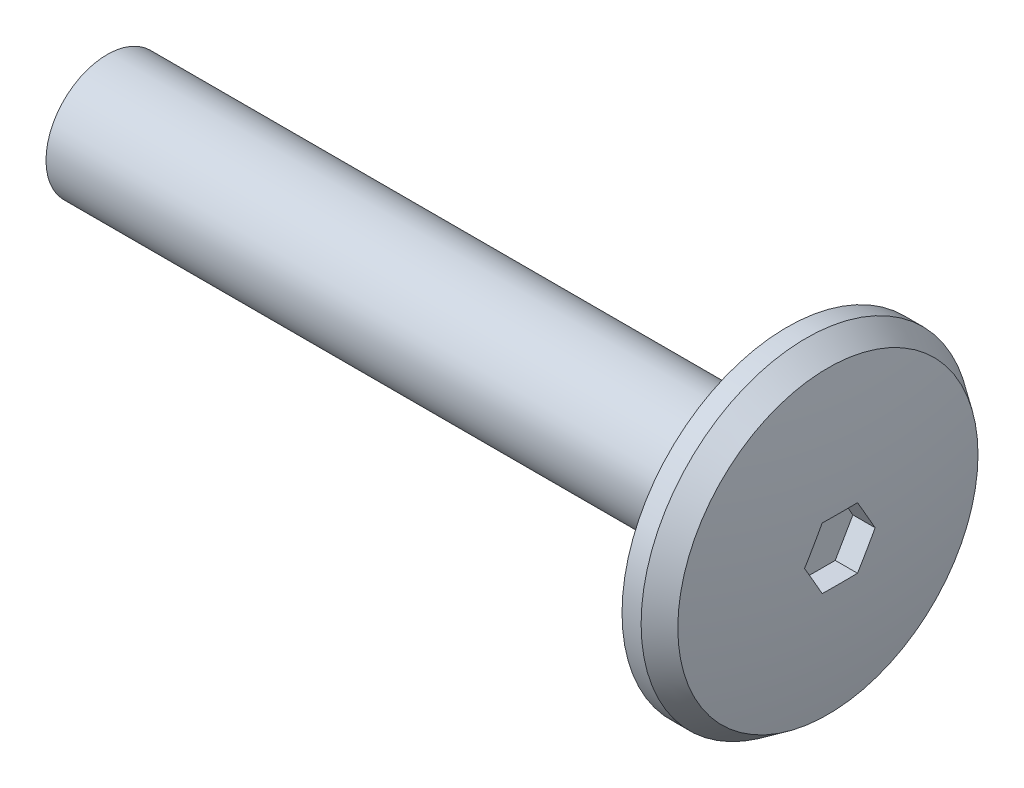
ISO-10303-21;
HEADER;
FILE_DESCRIPTION(('STEP AP214'),'2;1');
FILE_NAME('part.step','',(''),(''),'','','');
FILE_SCHEMA(('AUTOMOTIVE_DESIGN { 1 0 10303 214 1 1 1 1 }'));
ENDSEC;
DATA;
#1=APPLICATION_CONTEXT('core data for automotive mechanical design processes');
#2=APPLICATION_PROTOCOL_DEFINITION('international standard','automotive_design',2000,#1);
#3=PRODUCT_CONTEXT('',#1,'mechanical');
#4=PRODUCT('Part','Part','',(#3));
#5=PRODUCT_RELATED_PRODUCT_CATEGORY('part','',(#4));
#6=PRODUCT_DEFINITION_FORMATION('','',#4);
#7=PRODUCT_DEFINITION_CONTEXT('part definition',#1,'design');
#8=PRODUCT_DEFINITION('design','',#6,#7);
#9=PRODUCT_DEFINITION_SHAPE('','',#8);
#10=(LENGTH_UNIT() NAMED_UNIT(*) SI_UNIT(.MILLI.,.METRE.));
#11=(NAMED_UNIT(*) PLANE_ANGLE_UNIT() SI_UNIT($,.RADIAN.));
#12=(NAMED_UNIT(*) SI_UNIT($,.STERADIAN.) SOLID_ANGLE_UNIT());
#13=UNCERTAINTY_MEASURE_WITH_UNIT(LENGTH_MEASURE(1.E-05),#10,'distance_accuracy_value','');
#14=(GEOMETRIC_REPRESENTATION_CONTEXT(3) GLOBAL_UNCERTAINTY_ASSIGNED_CONTEXT((#13)) GLOBAL_UNIT_ASSIGNED_CONTEXT((#10,
#11,#12)) REPRESENTATION_CONTEXT('',''));
#15=CARTESIAN_POINT('',(0.,0.,0.));
#16=DIRECTION('',(0.,0.,1.));
#17=DIRECTION('',(1.,0.,0.));
#18=AXIS2_PLACEMENT_3D('',#15,#16,#17);
#19=CARTESIAN_POINT('',(44.,10.8,0.));
#20=DIRECTION('',(1.,0.,0.));
#21=DIRECTION('',(0.,0.,-1.));
#22=AXIS2_PLACEMENT_3D('',#19,#20,#21);
#23=PLANE('',#22);
#24=CARTESIAN_POINT('',(44.,0.,0.));
#25=DIRECTION('',(1.,0.,0.));
#26=DIRECTION('',(0.,0.,-1.));
#27=AXIS2_PLACEMENT_3D('',#24,#25,#26);
#28=CIRCLE('',#27,5.5);
#29=CARTESIAN_POINT('',(44.,0.,-5.5));
#30=VERTEX_POINT('',#29);
#31=EDGE_CURVE('E157',#30,#30,#28,.F.);
#32=ORIENTED_EDGE('',*,*,#31,.T.);
#33=EDGE_LOOP('',(#32));
#34=FACE_BOUND('',#33,.T.);
#35=CARTESIAN_POINT('',(44.,0.,0.));
#36=DIRECTION('',(-1.,0.,0.));
#37=DIRECTION('',(0.,0.,1.));
#38=AXIS2_PLACEMENT_3D('',#35,#36,#37);
#39=CIRCLE('',#38,4.);
#40=CARTESIAN_POINT('',(44.,0.,4.));
#41=VERTEX_POINT('',#40);
#42=EDGE_CURVE('E148',#41,#41,#39,.T.);
#43=ORIENTED_EDGE('',*,*,#42,.F.);
#44=EDGE_LOOP('',(#43));
#45=FACE_BOUND('',#44,.T.);
#46=ADVANCED_FACE('F40',(#34,#45),#23,.F.);
#47=CARTESIAN_POINT('',(0.,4.,0.));
#48=DIRECTION('',(1.,0.,0.));
#49=DIRECTION('',(0.,0.,-1.));
#50=AXIS2_PLACEMENT_3D('',#47,#48,#49);
#51=PLANE('',#50);
#52=CARTESIAN_POINT('',(0.,0.,0.));
#53=DIRECTION('',(-1.,0.,0.));
#54=DIRECTION('',(0.,0.,1.));
#55=AXIS2_PLACEMENT_3D('',#52,#53,#54);
#56=CIRCLE('',#55,2.49999999999999);
#57=CARTESIAN_POINT('',(0.,0.,2.49999999999999));
#58=VERTEX_POINT('',#57);
#59=EDGE_CURVE('E139',#58,#58,#56,.T.);
#60=ORIENTED_EDGE('',*,*,#59,.F.);
#61=EDGE_LOOP('',(#60));
#62=FACE_BOUND('',#61,.T.);
#63=CARTESIAN_POINT('',(0.,0.,0.));
#64=DIRECTION('',(-1.,0.,0.));
#65=DIRECTION('',(0.,0.,1.));
#66=AXIS2_PLACEMENT_3D('',#63,#64,#65);
#67=CIRCLE('',#66,4.);
#68=CARTESIAN_POINT('',(0.,0.,4.));
#69=VERTEX_POINT('',#68);
#70=EDGE_CURVE('E145',#69,#69,#67,.T.);
#71=ORIENTED_EDGE('',*,*,#70,.T.);
#72=EDGE_LOOP('',(#71));
#73=FACE_BOUND('',#72,.T.);
#74=ADVANCED_FACE('F194',(#62,#73),#51,.F.);
#75=CARTESIAN_POINT('',(0.,0.,0.));
#76=DIRECTION('',(-1.,0.,0.));
#77=DIRECTION('',(0.,0.,1.));
#78=AXIS2_PLACEMENT_3D('',#75,#76,#77);
#79=CYLINDRICAL_SURFACE('',#78,4.);
#80=ORIENTED_EDGE('',*,*,#70,.F.);
#81=EDGE_LOOP('',(#80));
#82=FACE_BOUND('',#81,.T.);
#83=ORIENTED_EDGE('',*,*,#42,.T.);
#84=EDGE_LOOP('',(#83));
#85=FACE_BOUND('',#84,.T.);
#86=ADVANCED_FACE('F200',(#82,#85),#79,.T.);
#87=CARTESIAN_POINT('',(20.,0.,0.));
#88=DIRECTION('',(-1.,0.,0.));
#89=DIRECTION('',(0.,0.,1.));
#90=AXIS2_PLACEMENT_3D('',#87,#88,#89);
#91=CONICAL_SURFACE('',#90,2.5,1.02974425867665);
#92=CARTESIAN_POINT('',(21.5021515475689,0.,0.));
#93=VERTEX_POINT('',#92);
#94=VERTEX_LOOP('',#93);
#95=FACE_BOUND('',#94,.T.);
#96=CARTESIAN_POINT('',(20.,0.,0.));
#97=DIRECTION('',(-1.,0.,0.));
#98=DIRECTION('',(0.,0.,1.));
#99=AXIS2_PLACEMENT_3D('',#96,#97,#98);
#100=CIRCLE('',#99,2.5);
#101=CARTESIAN_POINT('',(20.,0.,2.5));
#102=VERTEX_POINT('',#101);
#103=EDGE_CURVE('E142',#102,#102,#100,.T.);
#104=ORIENTED_EDGE('',*,*,#103,.T.);
#105=EDGE_LOOP('',(#104));
#106=FACE_BOUND('',#105,.T.);
#107=ADVANCED_FACE('F231',(#95,#106),#91,.F.);
#108=CARTESIAN_POINT('',(0.,0.,0.));
#109=DIRECTION('',(-1.,0.,0.));
#110=DIRECTION('',(0.,0.,1.));
#111=AXIS2_PLACEMENT_3D('',#108,#109,#110);
#112=CYLINDRICAL_SURFACE('',#111,2.49999999999999);
#113=ORIENTED_EDGE('',*,*,#103,.F.);
#114=EDGE_LOOP('',(#113));
#115=FACE_BOUND('',#114,.T.);
#116=ORIENTED_EDGE('',*,*,#59,.T.);
#117=EDGE_LOOP('',(#116));
#118=FACE_BOUND('',#117,.T.);
#119=ADVANCED_FACE('F225',(#115,#118),#112,.F.);
#120=CARTESIAN_POINT('',(44.5,0.,0.));
#121=DIRECTION('',(-1.,0.,0.));
#122=DIRECTION('',(0.,0.,1.));
#123=AXIS2_PLACEMENT_3D('',#120,#121,#122);
#124=PLANE('',#123);
#125=CARTESIAN_POINT('',(44.5,0.,0.));
#126=DIRECTION('',(-1.,0.,0.));
#127=DIRECTION('',(0.,0.,1.));
#128=AXIS2_PLACEMENT_3D('',#125,#126,#127);
#129=CIRCLE('',#128,6.);
#130=CARTESIAN_POINT('',(44.5,0.,6.));
#131=VERTEX_POINT('',#130);
#132=EDGE_CURVE('E126',#131,#131,#129,.T.);
#133=ORIENTED_EDGE('',*,*,#132,.F.);
#134=EDGE_LOOP('',(#133));
#135=FACE_BOUND('',#134,.T.);
#136=CARTESIAN_POINT('',(44.5,0.,0.));
#137=DIRECTION('',(-1.,0.,0.));
#138=DIRECTION('',(0.,0.,1.));
#139=AXIS2_PLACEMENT_3D('',#136,#137,#138);
#140=CIRCLE('',#139,10.8);
#141=CARTESIAN_POINT('',(44.5,0.,10.8));
#142=VERTEX_POINT('',#141);
#143=EDGE_CURVE('E136',#142,#142,#140,.T.);
#144=ORIENTED_EDGE('',*,*,#143,.T.);
#145=EDGE_LOOP('',(#144));
#146=FACE_BOUND('',#145,.T.);
#147=ADVANCED_FACE('F213',(#135,#146),#124,.T.);
#148=CARTESIAN_POINT('',(-10.8199999999999,0.,0.));
#149=DIRECTION('',(-1.,0.,0.));
#150=DIRECTION('',(0.,1.,0.));
#151=AXIS2_PLACEMENT_3D('',#148,#149,#150);
#152=SPHERICAL_SURFACE('',#151,58.82);
#153=CARTESIAN_POINT('',(-10.8199999999999,-1.,-1.73205080756888));
#154=DIRECTION('',(0.,-0.5,-0.866025403784439));
#155=DIRECTION('',(0.,0.866025403784439,-0.5));
#156=AXIS2_PLACEMENT_3D('',#153,#154,#155);
#157=CIRCLE('',#156,58.7859881264234);
#158=CARTESIAN_POINT('',(47.9546464614349,0.,-2.3094010767585));
#159=VERTEX_POINT('',#158);
#160=CARTESIAN_POINT('',(47.9546464614349,-2.,-1.15470053837925));
#161=VERTEX_POINT('',#160);
#162=EDGE_CURVE('E48',#159,#161,#157,.T.);
#163=ORIENTED_EDGE('',*,*,#162,.T.);
#164=CARTESIAN_POINT('',(-10.8199999999999,-2.,0.));
#165=DIRECTION('',(0.,-1.,0.));
#166=DIRECTION('',(0.,0.,-1.));
#167=AXIS2_PLACEMENT_3D('',#164,#165,#166);
#168=CIRCLE('',#167,58.7859881264234);
#169=CARTESIAN_POINT('',(47.9546464614349,-2.,1.15470053837925));
#170=VERTEX_POINT('',#169);
#171=EDGE_CURVE('E11',#161,#170,#168,.T.);
#172=ORIENTED_EDGE('',*,*,#171,.T.);
#173=CARTESIAN_POINT('',(-10.8199999999999,-1.,1.73205080756888));
#174=DIRECTION('',(0.,-0.5,0.866025403784439));
#175=DIRECTION('',(0.,-0.866025403784439,-0.5));
#176=AXIS2_PLACEMENT_3D('',#173,#174,#175);
#177=CIRCLE('',#176,58.7859881264234);
#178=CARTESIAN_POINT('',(47.9546464614349,0.,2.3094010767585));
#179=VERTEX_POINT('',#178);
#180=EDGE_CURVE('E96',#170,#179,#177,.T.);
#181=ORIENTED_EDGE('',*,*,#180,.T.);
#182=CARTESIAN_POINT('',(-10.8199999999999,1.,1.73205080756888));
#183=DIRECTION('',(0.,0.5,0.866025403784439));
#184=DIRECTION('',(0.,-0.866025403784439,0.5));
#185=AXIS2_PLACEMENT_3D('',#182,#183,#184);
#186=CIRCLE('',#185,58.7859881264234);
#187=CARTESIAN_POINT('',(47.9546464614349,2.,1.15470053837925));
#188=VERTEX_POINT('',#187);
#189=EDGE_CURVE('E161',#179,#188,#186,.T.);
#190=ORIENTED_EDGE('',*,*,#189,.T.);
#191=CARTESIAN_POINT('',(-10.8199999999999,2.,0.));
#192=DIRECTION('',(0.,1.,0.));
#193=DIRECTION('',(0.,0.,1.));
#194=AXIS2_PLACEMENT_3D('',#191,#192,#193);
#195=CIRCLE('',#194,58.7859881264234);
#196=CARTESIAN_POINT('',(47.9546464614349,2.,-1.15470053837925));
#197=VERTEX_POINT('',#196);
#198=EDGE_CURVE('E164',#188,#197,#195,.T.);
#199=ORIENTED_EDGE('',*,*,#198,.T.);
#200=CARTESIAN_POINT('',(-10.8199999999999,1.,-1.73205080756888));
#201=DIRECTION('',(0.,0.5,-0.866025403784439));
#202=DIRECTION('',(0.,0.866025403784439,0.5));
#203=AXIS2_PLACEMENT_3D('',#200,#201,#202);
#204=CIRCLE('',#203,58.7859881264234);
#205=EDGE_CURVE('E167',#197,#159,#204,.T.);
#206=ORIENTED_EDGE('',*,*,#205,.T.);
#207=EDGE_LOOP('',(#163,#172,#181,#190,#199,#206));
#208=FACE_BOUND('',#207,.T.);
#209=CARTESIAN_POINT('',(47.173858650831,0.,0.));
#210=DIRECTION('',(-1.,0.,0.));
#211=DIRECTION('',(0.,0.,1.));
#212=AXIS2_PLACEMENT_3D('',#209,#210,#211);
#213=CIRCLE('',#212,9.82368356511115);
#214=CARTESIAN_POINT('',(47.173858650831,0.,9.82368356511115));
#215=VERTEX_POINT('',#214);
#216=EDGE_CURVE('E154',#215,#215,#213,.F.);
#217=ORIENTED_EDGE('',*,*,#216,.T.);
#218=EDGE_LOOP('',(#217));
#219=FACE_BOUND('',#218,.T.);
#220=ADVANCED_FACE('F171',(#208,#219),#152,.T.);
#221=CARTESIAN_POINT('',(45.7490429604424,0.,0.));
#222=DIRECTION('',(-1.,0.,0.));
#223=DIRECTION('',(0.,0.,1.));
#224=AXIS2_PLACEMENT_3D('',#221,#222,#223);
#225=CONICAL_SURFACE('',#224,10.8,0.600739493934246);
#226=ORIENTED_EDGE('',*,*,#216,.F.);
#227=EDGE_LOOP('',(#226));
#228=FACE_BOUND('',#227,.T.);
#229=CARTESIAN_POINT('',(45.7490429604424,0.,0.));
#230=DIRECTION('',(-1.,0.,0.));
#231=DIRECTION('',(0.,0.,1.));
#232=AXIS2_PLACEMENT_3D('',#229,#230,#231);
#233=CIRCLE('',#232,10.8);
#234=CARTESIAN_POINT('',(45.7490429604424,0.,10.8));
#235=VERTEX_POINT('',#234);
#236=EDGE_CURVE('E151',#235,#235,#233,.T.);
#237=ORIENTED_EDGE('',*,*,#236,.F.);
#238=EDGE_LOOP('',(#237));
#239=FACE_BOUND('',#238,.T.);
#240=ADVANCED_FACE('F210',(#228,#239),#225,.T.);
#241=CARTESIAN_POINT('',(0.,0.,0.));
#242=DIRECTION('',(-1.,0.,0.));
#243=DIRECTION('',(0.,0.,1.));
#244=AXIS2_PLACEMENT_3D('',#241,#242,#243);
#245=CYLINDRICAL_SURFACE('',#244,10.8);
#246=ORIENTED_EDGE('',*,*,#236,.T.);
#247=EDGE_LOOP('',(#246));
#248=FACE_BOUND('',#247,.T.);
#249=ORIENTED_EDGE('',*,*,#143,.F.);
#250=EDGE_LOOP('',(#249));
#251=FACE_BOUND('',#250,.T.);
#252=ADVANCED_FACE('F207',(#248,#251),#245,.T.);
#253=CARTESIAN_POINT('',(44.,0.,0.));
#254=DIRECTION('',(1.,0.,0.));
#255=DIRECTION('',(0.,0.,-1.));
#256=AXIS2_PLACEMENT_3D('',#253,#254,#255);
#257=CONICAL_SURFACE('',#256,5.5,0.785398163397451);
#258=ORIENTED_EDGE('',*,*,#132,.T.);
#259=EDGE_LOOP('',(#258));
#260=FACE_BOUND('',#259,.T.);
#261=ORIENTED_EDGE('',*,*,#31,.F.);
#262=EDGE_LOOP('',(#261));
#263=FACE_BOUND('',#262,.T.);
#264=ADVANCED_FACE('F42',(#260,#263),#257,.T.);
#265=CARTESIAN_POINT('',(48.,-2.,-1.15470053837925));
#266=DIRECTION('',(0.,-1.,0.));
#267=DIRECTION('',(0.,0.,-1.));
#268=AXIS2_PLACEMENT_3D('',#265,#266,#267);
#269=PLANE('',#268);
#270=DIRECTION('',(-1.,0.,0.));
#271=VECTOR('',#270,1.);
#272=CARTESIAN_POINT('',(48.,-2.,-1.15470053837925));
#273=LINE('',#272,#271);
#274=CARTESIAN_POINT('',(46.5,-2.,-1.15470053837925));
#275=VERTEX_POINT('',#274);
#276=EDGE_CURVE('E114',#161,#275,#273,.T.);
#277=ORIENTED_EDGE('',*,*,#276,.T.);
#278=DIRECTION('',(0.,0.,1.));
#279=VECTOR('',#278,1.);
#280=CARTESIAN_POINT('',(46.5,-2.,-1.15470053837925));
#281=LINE('',#280,#279);
#282=CARTESIAN_POINT('',(46.5,-2.,1.15470053837925));
#283=VERTEX_POINT('',#282);
#284=EDGE_CURVE('E106',#275,#283,#281,.T.);
#285=ORIENTED_EDGE('',*,*,#284,.T.);
#286=DIRECTION('',(-1.,0.,0.));
#287=VECTOR('',#286,1.);
#288=CARTESIAN_POINT('',(48.,-2.,1.15470053837925));
#289=LINE('',#288,#287);
#290=EDGE_CURVE('E91',#170,#283,#289,.T.);
#291=ORIENTED_EDGE('',*,*,#290,.F.);
#292=ORIENTED_EDGE('',*,*,#171,.F.);
#293=EDGE_LOOP('',(#277,#285,#291,#292));
#294=FACE_BOUND('',#293,.T.);
#295=ADVANCED_FACE('F112',(#294),#269,.F.);
#296=CARTESIAN_POINT('',(48.,0.,-2.3094010767585));
#297=DIRECTION('',(0.,-0.5,-0.866025403784439));
#298=DIRECTION('',(0.,0.866025403784439,-0.5));
#299=AXIS2_PLACEMENT_3D('',#296,#297,#298);
#300=PLANE('',#299);
#301=DIRECTION('',(-1.,0.,0.));
#302=VECTOR('',#301,1.);
#303=CARTESIAN_POINT('',(48.,0.,-2.3094010767585));
#304=LINE('',#303,#302);
#305=CARTESIAN_POINT('',(46.5,0.,-2.3094010767585));
#306=VERTEX_POINT('',#305);
#307=EDGE_CURVE('E127',#159,#306,#304,.T.);
#308=ORIENTED_EDGE('',*,*,#307,.T.);
#309=DIRECTION('',(0.,-0.866025403784439,0.5));
#310=VECTOR('',#309,1.);
#311=CARTESIAN_POINT('',(46.5,0.,-2.3094010767585));
#312=LINE('',#311,#310);
#313=EDGE_CURVE('E99',#306,#275,#312,.T.);
#314=ORIENTED_EDGE('',*,*,#313,.T.);
#315=ORIENTED_EDGE('',*,*,#276,.F.);
#316=ORIENTED_EDGE('',*,*,#162,.F.);
#317=EDGE_LOOP('',(#308,#314,#315,#316));
#318=FACE_BOUND('',#317,.T.);
#319=ADVANCED_FACE('F175',(#318),#300,.F.);
#320=CARTESIAN_POINT('',(48.,2.,-1.15470053837925));
#321=DIRECTION('',(0.,0.5,-0.866025403784439));
#322=DIRECTION('',(0.,0.866025403784439,0.5));
#323=AXIS2_PLACEMENT_3D('',#320,#321,#322);
#324=PLANE('',#323);
#325=DIRECTION('',(-1.,0.,0.));
#326=VECTOR('',#325,1.);
#327=CARTESIAN_POINT('',(48.,2.,-1.15470053837925));
#328=LINE('',#327,#326);
#329=CARTESIAN_POINT('',(46.5,2.,-1.15470053837925));
#330=VERTEX_POINT('',#329);
#331=EDGE_CURVE('E129',#197,#330,#328,.T.);
#332=ORIENTED_EDGE('',*,*,#331,.T.);
#333=DIRECTION('',(0.,-0.866025403784438,-0.5));
#334=VECTOR('',#333,1.);
#335=CARTESIAN_POINT('',(46.5,2.,-1.15470053837925));
#336=LINE('',#335,#334);
#337=EDGE_CURVE('E121',#330,#306,#336,.T.);
#338=ORIENTED_EDGE('',*,*,#337,.T.);
#339=ORIENTED_EDGE('',*,*,#307,.F.);
#340=ORIENTED_EDGE('',*,*,#205,.F.);
#341=EDGE_LOOP('',(#332,#338,#339,#340));
#342=FACE_BOUND('',#341,.T.);
#343=ADVANCED_FACE('F177',(#342),#324,.F.);
#344=CARTESIAN_POINT('',(48.,2.,1.15470053837925));
#345=DIRECTION('',(0.,1.,0.));
#346=DIRECTION('',(0.,0.,1.));
#347=AXIS2_PLACEMENT_3D('',#344,#345,#346);
#348=PLANE('',#347);
#349=DIRECTION('',(-1.,0.,0.));
#350=VECTOR('',#349,1.);
#351=CARTESIAN_POINT('',(48.,2.,1.15470053837925));
#352=LINE('',#351,#350);
#353=CARTESIAN_POINT('',(46.5,2.,1.15470053837925));
#354=VERTEX_POINT('',#353);
#355=EDGE_CURVE('E131',#188,#354,#352,.T.);
#356=ORIENTED_EDGE('',*,*,#355,.T.);
#357=DIRECTION('',(0.,0.,-1.));
#358=VECTOR('',#357,1.);
#359=CARTESIAN_POINT('',(46.5,2.,1.15470053837925));
#360=LINE('',#359,#358);
#361=EDGE_CURVE('E118',#354,#330,#360,.T.);
#362=ORIENTED_EDGE('',*,*,#361,.T.);
#363=ORIENTED_EDGE('',*,*,#331,.F.);
#364=ORIENTED_EDGE('',*,*,#198,.F.);
#365=EDGE_LOOP('',(#356,#362,#363,#364));
#366=FACE_BOUND('',#365,.T.);
#367=ADVANCED_FACE('F181',(#366),#348,.F.);
#368=CARTESIAN_POINT('',(48.,0.,2.3094010767585));
#369=DIRECTION('',(0.,0.5,0.866025403784439));
#370=DIRECTION('',(0.,-0.866025403784439,0.5));
#371=AXIS2_PLACEMENT_3D('',#368,#369,#370);
#372=PLANE('',#371);
#373=DIRECTION('',(-1.,0.,0.));
#374=VECTOR('',#373,1.);
#375=CARTESIAN_POINT('',(48.,0.,2.3094010767585));
#376=LINE('',#375,#374);
#377=CARTESIAN_POINT('',(46.5,0.,2.3094010767585));
#378=VERTEX_POINT('',#377);
#379=EDGE_CURVE('E55',#179,#378,#376,.T.);
#380=ORIENTED_EDGE('',*,*,#379,.T.);
#381=DIRECTION('',(0.,0.866025403784439,-0.5));
#382=VECTOR('',#381,1.);
#383=CARTESIAN_POINT('',(46.5,0.,2.3094010767585));
#384=LINE('',#383,#382);
#385=EDGE_CURVE('E110',#378,#354,#384,.T.);
#386=ORIENTED_EDGE('',*,*,#385,.T.);
#387=ORIENTED_EDGE('',*,*,#355,.F.);
#388=ORIENTED_EDGE('',*,*,#189,.F.);
#389=EDGE_LOOP('',(#380,#386,#387,#388));
#390=FACE_BOUND('',#389,.T.);
#391=ADVANCED_FACE('F184',(#390),#372,.F.);
#392=CARTESIAN_POINT('',(48.,-2.,1.15470053837925));
#393=DIRECTION('',(0.,-0.5,0.866025403784439));
#394=DIRECTION('',(0.,-0.866025403784439,-0.5));
#395=AXIS2_PLACEMENT_3D('',#392,#393,#394);
#396=PLANE('',#395);
#397=ORIENTED_EDGE('',*,*,#290,.T.);
#398=DIRECTION('',(0.,0.866025403784439,0.5));
#399=VECTOR('',#398,1.);
#400=CARTESIAN_POINT('',(46.5,-2.,1.15470053837925));
#401=LINE('',#400,#399);
#402=EDGE_CURVE('E94',#283,#378,#401,.T.);
#403=ORIENTED_EDGE('',*,*,#402,.T.);
#404=ORIENTED_EDGE('',*,*,#379,.F.);
#405=ORIENTED_EDGE('',*,*,#180,.F.);
#406=EDGE_LOOP('',(#397,#403,#404,#405));
#407=FACE_BOUND('',#406,.T.);
#408=ADVANCED_FACE('F93',(#407),#396,.F.);
#409=CARTESIAN_POINT('',(46.5,0.,0.));
#410=DIRECTION('',(-1.,0.,0.));
#411=DIRECTION('',(0.,0.,1.));
#412=AXIS2_PLACEMENT_3D('',#409,#410,#411);
#413=PLANE('',#412);
#414=ORIENTED_EDGE('',*,*,#284,.F.);
#415=ORIENTED_EDGE('',*,*,#313,.F.);
#416=ORIENTED_EDGE('',*,*,#337,.F.);
#417=ORIENTED_EDGE('',*,*,#361,.F.);
#418=ORIENTED_EDGE('',*,*,#385,.F.);
#419=ORIENTED_EDGE('',*,*,#402,.F.);
#420=EDGE_LOOP('',(#414,#415,#416,#417,#418,#419));
#421=FACE_BOUND('',#420,.T.);
#422=ADVANCED_FACE('F104',(#421),#413,.F.);
#423=CLOSED_SHELL('',(#46,#74,#86,#107,#119,#147,#220,#240,#252,#264,#295,#319,#343,#367,#391,
#408,#422));
#424=MANIFOLD_SOLID_BREP('B2',#423);
#425=ADVANCED_BREP_SHAPE_REPRESENTATION('',(#18,#424),#14);
#426=SHAPE_DEFINITION_REPRESENTATION(#9,#425);
ENDSEC;
END-ISO-10303-21;
